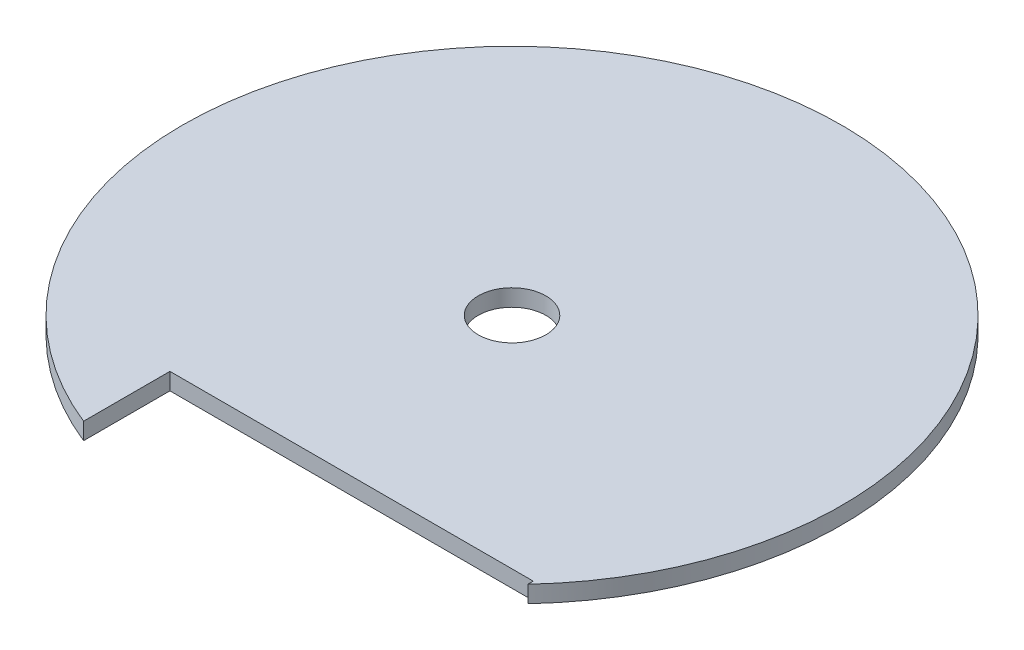
ISO-10303-21;
HEADER;
FILE_DESCRIPTION(('STEP AP214'),'2;1');
FILE_NAME('part.step','',(''),(''),'','','');
FILE_SCHEMA(('AUTOMOTIVE_DESIGN { 1 0 10303 214 1 1 1 1 }'));
ENDSEC;
DATA;
#1=APPLICATION_CONTEXT('core data for automotive mechanical design processes');
#2=APPLICATION_PROTOCOL_DEFINITION('international standard','automotive_design',2000,#1);
#3=PRODUCT_CONTEXT('',#1,'mechanical');
#4=PRODUCT('Part','Part','',(#3));
#5=PRODUCT_RELATED_PRODUCT_CATEGORY('part','',(#4));
#6=PRODUCT_DEFINITION_FORMATION('','',#4);
#7=PRODUCT_DEFINITION_CONTEXT('part definition',#1,'design');
#8=PRODUCT_DEFINITION('design','',#6,#7);
#9=PRODUCT_DEFINITION_SHAPE('','',#8);
#10=(LENGTH_UNIT() NAMED_UNIT(*) SI_UNIT(.MILLI.,.METRE.));
#11=(NAMED_UNIT(*) PLANE_ANGLE_UNIT() SI_UNIT($,.RADIAN.));
#12=(NAMED_UNIT(*) SI_UNIT($,.STERADIAN.) SOLID_ANGLE_UNIT());
#13=UNCERTAINTY_MEASURE_WITH_UNIT(LENGTH_MEASURE(1.E-05),#10,'distance_accuracy_value','');
#14=(GEOMETRIC_REPRESENTATION_CONTEXT(3) GLOBAL_UNCERTAINTY_ASSIGNED_CONTEXT((#13)) GLOBAL_UNIT_ASSIGNED_CONTEXT((#10,
#11,#12)) REPRESENTATION_CONTEXT('',''));
#15=CARTESIAN_POINT('',(0.,0.,0.));
#16=DIRECTION('',(0.,0.,1.));
#17=DIRECTION('',(1.,0.,0.));
#18=AXIS2_PLACEMENT_3D('',#15,#16,#17);
#19=CARTESIAN_POINT('',(0.,2.,0.));
#20=DIRECTION('',(0.,1.,0.));
#21=DIRECTION('',(0.,0.,1.));
#22=AXIS2_PLACEMENT_3D('',#19,#20,#21);
#23=PLANE('',#22);
#24=DIRECTION('',(0.,0.,-1.));
#25=VECTOR('',#24,1.);
#26=CARTESIAN_POINT('',(28.5,2.,68.9868402823351));
#27=LINE('',#26,#25);
#28=CARTESIAN_POINT('',(28.5,2.,26.6223590239483));
#29=VERTEX_POINT('',#28);
#30=CARTESIAN_POINT('',(28.5,2.,25.9868402823351));
#31=VERTEX_POINT('',#30);
#32=EDGE_CURVE('E88',#29,#31,#27,.T.);
#33=ORIENTED_EDGE('',*,*,#32,.F.);
#34=CARTESIAN_POINT('',(0.,2.,0.));
#35=DIRECTION('',(0.,1.,0.));
#36=DIRECTION('',(0.,0.,1.));
#37=AXIS2_PLACEMENT_3D('',#34,#35,#36);
#38=CIRCLE('',#37,39.);
#39=CARTESIAN_POINT('',(-14.5,2.,36.2042815147601));
#40=VERTEX_POINT('',#39);
#41=EDGE_CURVE('E129',#29,#40,#38,.T.);
#42=ORIENTED_EDGE('',*,*,#41,.T.);
#43=DIRECTION('',(0.,0.,1.));
#44=VECTOR('',#43,1.);
#45=CARTESIAN_POINT('',(-14.5,2.,68.9868402823351));
#46=LINE('',#45,#44);
#47=CARTESIAN_POINT('',(-14.5,2.,25.9868402823351));
#48=VERTEX_POINT('',#47);
#49=EDGE_CURVE('E59',#48,#40,#46,.T.);
#50=ORIENTED_EDGE('',*,*,#49,.F.);
#51=DIRECTION('',(-1.,0.,0.));
#52=VECTOR('',#51,1.);
#53=CARTESIAN_POINT('',(-14.5,2.,25.9868402823351));
#54=LINE('',#53,#52);
#55=EDGE_CURVE('E110',#31,#48,#54,.T.);
#56=ORIENTED_EDGE('',*,*,#55,.F.);
#57=EDGE_LOOP('',(#33,#42,#50,#56));
#58=FACE_BOUND('',#57,.T.);
#59=CARTESIAN_POINT('',(0.,2.,0.));
#60=DIRECTION('',(0.,1.,0.));
#61=DIRECTION('',(0.,0.,1.));
#62=AXIS2_PLACEMENT_3D('',#59,#60,#61);
#63=CIRCLE('',#62,4.);
#64=CARTESIAN_POINT('',(0.,2.,4.));
#65=VERTEX_POINT('',#64);
#66=EDGE_CURVE('E122',#65,#65,#63,.T.);
#67=ORIENTED_EDGE('',*,*,#66,.F.);
#68=EDGE_LOOP('',(#67));
#69=FACE_BOUND('',#68,.T.);
#70=ADVANCED_FACE('F43',(#58,#69),#23,.T.);
#71=CARTESIAN_POINT('',(0.,0.,0.));
#72=DIRECTION('',(0.,1.,0.));
#73=DIRECTION('',(0.,0.,1.));
#74=AXIS2_PLACEMENT_3D('',#71,#72,#73);
#75=PLANE('',#74);
#76=CARTESIAN_POINT('',(0.,0.,0.));
#77=DIRECTION('',(0.,1.,0.));
#78=DIRECTION('',(0.,0.,1.));
#79=AXIS2_PLACEMENT_3D('',#76,#77,#78);
#80=CIRCLE('',#79,39.);
#81=CARTESIAN_POINT('',(28.5,0.,26.6223590239483));
#82=VERTEX_POINT('',#81);
#83=CARTESIAN_POINT('',(-14.5,0.,36.2042815147601));
#84=VERTEX_POINT('',#83);
#85=EDGE_CURVE('E106',#82,#84,#80,.T.);
#86=ORIENTED_EDGE('',*,*,#85,.F.);
#87=DIRECTION('',(0.,0.,-1.));
#88=VECTOR('',#87,1.);
#89=CARTESIAN_POINT('',(28.5,0.,68.9868402823351));
#90=LINE('',#89,#88);
#91=CARTESIAN_POINT('',(28.5,0.,25.9868402823351));
#92=VERTEX_POINT('',#91);
#93=EDGE_CURVE('E86',#82,#92,#90,.T.);
#94=ORIENTED_EDGE('',*,*,#93,.T.);
#95=DIRECTION('',(-1.,0.,0.));
#96=VECTOR('',#95,1.);
#97=CARTESIAN_POINT('',(-14.5,0.,25.9868402823351));
#98=LINE('',#97,#96);
#99=CARTESIAN_POINT('',(-14.5,0.,25.9868402823351));
#100=VERTEX_POINT('',#99);
#101=EDGE_CURVE('E97',#92,#100,#98,.T.);
#102=ORIENTED_EDGE('',*,*,#101,.T.);
#103=DIRECTION('',(0.,0.,1.));
#104=VECTOR('',#103,1.);
#105=CARTESIAN_POINT('',(-14.5,0.,68.9868402823351));
#106=LINE('',#105,#104);
#107=EDGE_CURVE('E94',#100,#84,#106,.T.);
#108=ORIENTED_EDGE('',*,*,#107,.T.);
#109=EDGE_LOOP('',(#86,#94,#102,#108));
#110=FACE_BOUND('',#109,.T.);
#111=CARTESIAN_POINT('',(0.,0.,0.));
#112=DIRECTION('',(0.,1.,0.));
#113=DIRECTION('',(0.,0.,1.));
#114=AXIS2_PLACEMENT_3D('',#111,#112,#113);
#115=CIRCLE('',#114,4.);
#116=CARTESIAN_POINT('',(0.,0.,4.));
#117=VERTEX_POINT('',#116);
#118=EDGE_CURVE('E120',#117,#117,#115,.T.);
#119=ORIENTED_EDGE('',*,*,#118,.T.);
#120=EDGE_LOOP('',(#119));
#121=FACE_BOUND('',#120,.T.);
#122=ADVANCED_FACE('F103',(#110,#121),#75,.F.);
#123=CARTESIAN_POINT('',(0.,2.,0.));
#124=DIRECTION('',(0.,-1.,0.));
#125=DIRECTION('',(0.,0.,-1.));
#126=AXIS2_PLACEMENT_3D('',#123,#124,#125);
#127=CYLINDRICAL_SURFACE('',#126,39.);
#128=ORIENTED_EDGE('',*,*,#41,.F.);
#129=DIRECTION('',(0.,-1.,0.));
#130=VECTOR('',#129,1.);
#131=CARTESIAN_POINT('',(28.5,2.,26.6223590239483));
#132=LINE('',#131,#130);
#133=EDGE_CURVE('E11',#29,#82,#132,.T.);
#134=ORIENTED_EDGE('',*,*,#133,.T.);
#135=ORIENTED_EDGE('',*,*,#85,.T.);
#136=DIRECTION('',(0.,-1.,0.));
#137=VECTOR('',#136,1.);
#138=CARTESIAN_POINT('',(-14.5,2.,36.2042815147601));
#139=LINE('',#138,#137);
#140=EDGE_CURVE('E52',#84,#40,#139,.F.);
#141=ORIENTED_EDGE('',*,*,#140,.T.);
#142=EDGE_LOOP('',(#128,#134,#135,#141));
#143=FACE_BOUND('',#142,.T.);
#144=ADVANCED_FACE('F45',(#143),#127,.T.);
#145=CARTESIAN_POINT('',(0.,2.,0.));
#146=DIRECTION('',(0.,-1.,0.));
#147=DIRECTION('',(0.,0.,-1.));
#148=AXIS2_PLACEMENT_3D('',#145,#146,#147);
#149=CYLINDRICAL_SURFACE('',#148,4.);
#150=ORIENTED_EDGE('',*,*,#66,.T.);
#151=EDGE_LOOP('',(#150));
#152=FACE_BOUND('',#151,.T.);
#153=ORIENTED_EDGE('',*,*,#118,.F.);
#154=EDGE_LOOP('',(#153));
#155=FACE_BOUND('',#154,.T.);
#156=ADVANCED_FACE('F143',(#152,#155),#149,.F.);
#157=CARTESIAN_POINT('',(28.5,0.,68.9868402823351));
#158=DIRECTION('',(1.,0.,0.));
#159=DIRECTION('',(0.,0.,-1.));
#160=AXIS2_PLACEMENT_3D('',#157,#158,#159);
#161=PLANE('',#160);
#162=ORIENTED_EDGE('',*,*,#32,.T.);
#163=DIRECTION('',(0.,1.,0.));
#164=VECTOR('',#163,1.);
#165=CARTESIAN_POINT('',(28.5,0.,25.9868402823351));
#166=LINE('',#165,#164);
#167=EDGE_CURVE('E82',#92,#31,#166,.T.);
#168=ORIENTED_EDGE('',*,*,#167,.F.);
#169=ORIENTED_EDGE('',*,*,#93,.F.);
#170=ORIENTED_EDGE('',*,*,#133,.F.);
#171=EDGE_LOOP('',(#162,#168,#169,#170));
#172=FACE_BOUND('',#171,.T.);
#173=ADVANCED_FACE('F84',(#172),#161,.F.);
#174=CARTESIAN_POINT('',(-14.5,0.,68.9868402823351));
#175=DIRECTION('',(-1.,0.,0.));
#176=DIRECTION('',(0.,0.,1.));
#177=AXIS2_PLACEMENT_3D('',#174,#175,#176);
#178=PLANE('',#177);
#179=ORIENTED_EDGE('',*,*,#107,.F.);
#180=DIRECTION('',(0.,1.,0.));
#181=VECTOR('',#180,1.);
#182=CARTESIAN_POINT('',(-14.5,0.,25.9868402823351));
#183=LINE('',#182,#181);
#184=EDGE_CURVE('E93',#100,#48,#183,.T.);
#185=ORIENTED_EDGE('',*,*,#184,.T.);
#186=ORIENTED_EDGE('',*,*,#49,.T.);
#187=ORIENTED_EDGE('',*,*,#140,.F.);
#188=EDGE_LOOP('',(#179,#185,#186,#187));
#189=FACE_BOUND('',#188,.T.);
#190=ADVANCED_FACE('F155',(#189),#178,.F.);
#191=CARTESIAN_POINT('',(-14.5,0.,25.9868402823351));
#192=DIRECTION('',(0.,0.,-1.));
#193=DIRECTION('',(-1.,0.,0.));
#194=AXIS2_PLACEMENT_3D('',#191,#192,#193);
#195=PLANE('',#194);
#196=ORIENTED_EDGE('',*,*,#55,.T.);
#197=ORIENTED_EDGE('',*,*,#184,.F.);
#198=ORIENTED_EDGE('',*,*,#101,.F.);
#199=ORIENTED_EDGE('',*,*,#167,.T.);
#200=EDGE_LOOP('',(#196,#197,#198,#199));
#201=FACE_BOUND('',#200,.T.);
#202=ADVANCED_FACE('F98',(#201),#195,.F.);
#203=CLOSED_SHELL('',(#70,#122,#144,#156,#173,#190,#202));
#204=MANIFOLD_SOLID_BREP('B2',#203);
#205=ADVANCED_BREP_SHAPE_REPRESENTATION('',(#18,#204),#14);
#206=SHAPE_DEFINITION_REPRESENTATION(#9,#205);
ENDSEC;
END-ISO-10303-21;
